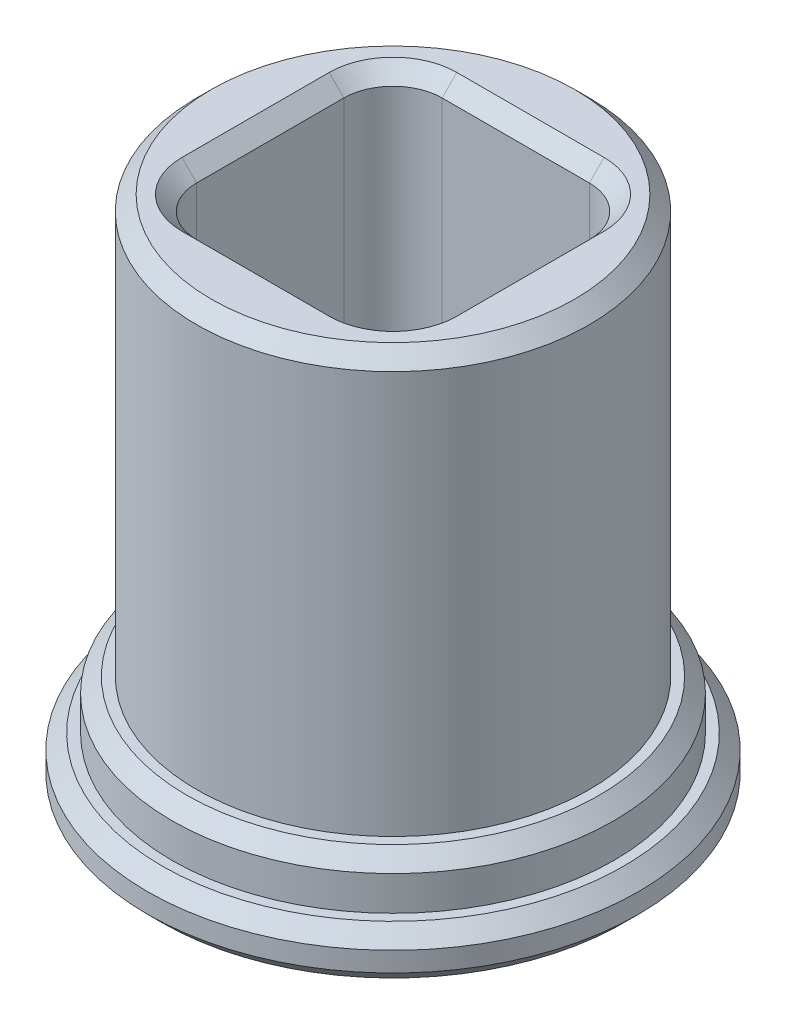
ISO-10303-21;
HEADER;
FILE_DESCRIPTION(('STEP AP214'),'2;1');
FILE_NAME('part.step','',(''),(''),'','','');
FILE_SCHEMA(('AUTOMOTIVE_DESIGN { 1 0 10303 214 1 1 1 1 }'));
ENDSEC;
DATA;
#1=APPLICATION_CONTEXT('core data for automotive mechanical design processes');
#2=APPLICATION_PROTOCOL_DEFINITION('international standard','automotive_design',2000,#1);
#3=PRODUCT_CONTEXT('',#1,'mechanical');
#4=PRODUCT('Part','Part','',(#3));
#5=PRODUCT_RELATED_PRODUCT_CATEGORY('part','',(#4));
#6=PRODUCT_DEFINITION_FORMATION('','',#4);
#7=PRODUCT_DEFINITION_CONTEXT('part definition',#1,'design');
#8=PRODUCT_DEFINITION('design','',#6,#7);
#9=PRODUCT_DEFINITION_SHAPE('','',#8);
#10=(LENGTH_UNIT() NAMED_UNIT(*) SI_UNIT(.MILLI.,.METRE.));
#11=(NAMED_UNIT(*) PLANE_ANGLE_UNIT() SI_UNIT($,.RADIAN.));
#12=(NAMED_UNIT(*) SI_UNIT($,.STERADIAN.) SOLID_ANGLE_UNIT());
#13=UNCERTAINTY_MEASURE_WITH_UNIT(LENGTH_MEASURE(1.E-05),#10,'distance_accuracy_value','');
#14=(GEOMETRIC_REPRESENTATION_CONTEXT(3) GLOBAL_UNCERTAINTY_ASSIGNED_CONTEXT((#13)) GLOBAL_UNIT_ASSIGNED_CONTEXT((#10,
#11,#12)) REPRESENTATION_CONTEXT('',''));
#15=CARTESIAN_POINT('',(0.,0.,0.));
#16=DIRECTION('',(0.,0.,1.));
#17=DIRECTION('',(1.,0.,0.));
#18=AXIS2_PLACEMENT_3D('',#15,#16,#17);
#19=CARTESIAN_POINT('',(0.,20.,0.));
#20=DIRECTION('',(0.,-1.,0.));
#21=DIRECTION('',(0.,0.,-1.));
#22=AXIS2_PLACEMENT_3D('',#19,#20,#21);
#23=CYLINDRICAL_SURFACE('',#22,2.2);
#24=CARTESIAN_POINT('',(0.,1.3,0.));
#25=DIRECTION('',(0.,-1.,0.));
#26=DIRECTION('',(0.,0.,-1.));
#27=AXIS2_PLACEMENT_3D('',#24,#25,#26);
#28=CIRCLE('',#27,2.2);
#29=CARTESIAN_POINT('',(0.,1.3,-2.2));
#30=VERTEX_POINT('',#29);
#31=EDGE_CURVE('E194',#30,#30,#28,.T.);
#32=ORIENTED_EDGE('',*,*,#31,.T.);
#33=EDGE_LOOP('',(#32));
#34=FACE_BOUND('',#33,.T.);
#35=CARTESIAN_POINT('',(0.,4.5,0.));
#36=DIRECTION('',(0.,-1.,0.));
#37=DIRECTION('',(0.,0.,-1.));
#38=AXIS2_PLACEMENT_3D('',#35,#36,#37);
#39=CIRCLE('',#38,2.2);
#40=CARTESIAN_POINT('',(0.,4.5,-2.2));
#41=VERTEX_POINT('',#40);
#42=EDGE_CURVE('E272',#41,#41,#39,.T.);
#43=ORIENTED_EDGE('',*,*,#42,.F.);
#44=EDGE_LOOP('',(#43));
#45=FACE_BOUND('',#44,.T.);
#46=ADVANCED_FACE('F43',(#34,#45),#23,.F.);
#47=CARTESIAN_POINT('',(0.,1.,0.));
#48=DIRECTION('',(0.,-1.,0.));
#49=DIRECTION('',(0.,0.,-1.));
#50=AXIS2_PLACEMENT_3D('',#47,#48,#49);
#51=CYLINDRICAL_SURFACE('',#50,5.);
#52=CARTESIAN_POINT('',(0.,0.300000000000002,0.));
#53=DIRECTION('',(0.,1.,0.));
#54=DIRECTION('',(0.,0.,1.));
#55=AXIS2_PLACEMENT_3D('',#52,#53,#54);
#56=CIRCLE('',#55,5.);
#57=CARTESIAN_POINT('',(0.,0.300000000000002,5.));
#58=VERTEX_POINT('',#57);
#59=EDGE_CURVE('E200',#58,#58,#56,.T.);
#60=ORIENTED_EDGE('',*,*,#59,.T.);
#61=EDGE_LOOP('',(#60));
#62=FACE_BOUND('',#61,.T.);
#63=CARTESIAN_POINT('',(0.,0.700000000000003,0.));
#64=DIRECTION('',(0.,1.,0.));
#65=DIRECTION('',(0.,0.,1.));
#66=AXIS2_PLACEMENT_3D('',#63,#64,#65);
#67=CIRCLE('',#66,5.);
#68=CARTESIAN_POINT('',(0.,0.700000000000003,5.));
#69=VERTEX_POINT('',#68);
#70=EDGE_CURVE('E197',#69,#69,#67,.F.);
#71=ORIENTED_EDGE('',*,*,#70,.T.);
#72=EDGE_LOOP('',(#71));
#73=FACE_BOUND('',#72,.T.);
#74=ADVANCED_FACE('F347',(#62,#73),#51,.T.);
#75=CARTESIAN_POINT('',(0.,1.,0.));
#76=DIRECTION('',(0.,1.,0.));
#77=DIRECTION('',(0.,0.,1.));
#78=AXIS2_PLACEMENT_3D('',#75,#76,#77);
#79=PLANE('',#78);
#80=CARTESIAN_POINT('',(0.,1.,0.));
#81=DIRECTION('',(0.,1.,0.));
#82=DIRECTION('',(0.,0.,1.));
#83=AXIS2_PLACEMENT_3D('',#80,#81,#82);
#84=CIRCLE('',#83,4.7);
#85=CARTESIAN_POINT('',(0.,1.,4.7));
#86=VERTEX_POINT('',#85);
#87=EDGE_CURVE('E203',#86,#86,#84,.T.);
#88=ORIENTED_EDGE('',*,*,#87,.T.);
#89=EDGE_LOOP('',(#88));
#90=FACE_BOUND('',#89,.T.);
#91=CARTESIAN_POINT('',(0.,1.,0.));
#92=DIRECTION('',(0.,1.,0.));
#93=DIRECTION('',(0.,0.,1.));
#94=AXIS2_PLACEMENT_3D('',#91,#92,#93);
#95=CIRCLE('',#94,4.5);
#96=CARTESIAN_POINT('',(0.,1.,4.5));
#97=VERTEX_POINT('',#96);
#98=EDGE_CURVE('E150',#97,#97,#95,.T.);
#99=ORIENTED_EDGE('',*,*,#98,.F.);
#100=EDGE_LOOP('',(#99));
#101=FACE_BOUND('',#100,.T.);
#102=ADVANCED_FACE('F353',(#90,#101),#79,.T.);
#103=CARTESIAN_POINT('',(0.,0.,0.));
#104=DIRECTION('',(0.,1.,0.));
#105=DIRECTION('',(0.,0.,1.));
#106=AXIS2_PLACEMENT_3D('',#103,#104,#105);
#107=PLANE('',#106);
#108=CARTESIAN_POINT('',(0.,0.,0.));
#109=DIRECTION('',(0.,1.,0.));
#110=DIRECTION('',(0.,0.,1.));
#111=AXIS2_PLACEMENT_3D('',#108,#109,#110);
#112=CIRCLE('',#111,4.05000000000001);
#113=CARTESIAN_POINT('',(0.,0.,-4.05000000000001));
#114=VERTEX_POINT('',#113);
#115=EDGE_CURVE('E188',#114,#114,#112,.T.);
#116=ORIENTED_EDGE('',*,*,#115,.T.);
#117=EDGE_LOOP('',(#116));
#118=FACE_BOUND('',#117,.T.);
#119=CARTESIAN_POINT('',(0.,0.,0.));
#120=DIRECTION('',(0.,1.,0.));
#121=DIRECTION('',(0.,0.,1.));
#122=AXIS2_PLACEMENT_3D('',#119,#120,#121);
#123=CIRCLE('',#122,4.7);
#124=CARTESIAN_POINT('',(0.,0.,4.7));
#125=VERTEX_POINT('',#124);
#126=EDGE_CURVE('E185',#125,#125,#123,.F.);
#127=ORIENTED_EDGE('',*,*,#126,.T.);
#128=EDGE_LOOP('',(#127));
#129=FACE_BOUND('',#128,.T.);
#130=ADVANCED_FACE('F385',(#118,#129),#107,.F.);
#131=CARTESIAN_POINT('',(0.,2.,0.));
#132=DIRECTION('',(0.,-1.,0.));
#133=DIRECTION('',(0.,0.,-1.));
#134=AXIS2_PLACEMENT_3D('',#131,#132,#133);
#135=CYLINDRICAL_SURFACE('',#134,4.5);
#136=CARTESIAN_POINT('',(0.,1.7,0.));
#137=DIRECTION('',(0.,1.,0.));
#138=DIRECTION('',(0.,0.,1.));
#139=AXIS2_PLACEMENT_3D('',#136,#137,#138);
#140=CIRCLE('',#139,4.5);
#141=CARTESIAN_POINT('',(0.,1.7,4.5));
#142=VERTEX_POINT('',#141);
#143=EDGE_CURVE('E209',#142,#142,#140,.F.);
#144=ORIENTED_EDGE('',*,*,#143,.T.);
#145=EDGE_LOOP('',(#144));
#146=FACE_BOUND('',#145,.T.);
#147=ORIENTED_EDGE('',*,*,#98,.T.);
#148=EDGE_LOOP('',(#147));
#149=FACE_BOUND('',#148,.T.);
#150=ADVANCED_FACE('F381',(#146,#149),#135,.T.);
#151=CARTESIAN_POINT('',(0.,2.,0.));
#152=DIRECTION('',(0.,1.,0.));
#153=DIRECTION('',(0.,0.,1.));
#154=AXIS2_PLACEMENT_3D('',#151,#152,#153);
#155=PLANE('',#154);
#156=CARTESIAN_POINT('',(0.,2.,0.));
#157=DIRECTION('',(0.,1.,0.));
#158=DIRECTION('',(0.,0.,1.));
#159=AXIS2_PLACEMENT_3D('',#156,#157,#158);
#160=CIRCLE('',#159,4.2);
#161=CARTESIAN_POINT('',(0.,2.,4.2));
#162=VERTEX_POINT('',#161);
#163=EDGE_CURVE('E206',#162,#162,#160,.T.);
#164=ORIENTED_EDGE('',*,*,#163,.T.);
#165=EDGE_LOOP('',(#164));
#166=FACE_BOUND('',#165,.T.);
#167=CARTESIAN_POINT('',(0.,2.,0.));
#168=DIRECTION('',(0.,1.,0.));
#169=DIRECTION('',(0.,0.,1.));
#170=AXIS2_PLACEMENT_3D('',#167,#168,#169);
#171=CIRCLE('',#170,4.);
#172=CARTESIAN_POINT('',(0.,2.,-4.));
#173=VERTEX_POINT('',#172);
#174=EDGE_CURVE('E285',#173,#173,#171,.T.);
#175=ORIENTED_EDGE('',*,*,#174,.F.);
#176=EDGE_LOOP('',(#175));
#177=FACE_BOUND('',#176,.T.);
#178=ADVANCED_FACE('F375',(#166,#177),#155,.T.);
#179=CARTESIAN_POINT('',(0.,10.5,0.));
#180=DIRECTION('',(0.,1.,0.));
#181=DIRECTION('',(0.,0.,1.));
#182=AXIS2_PLACEMENT_3D('',#179,#180,#181);
#183=PLANE('',#182);
#184=DIRECTION('',(1.,0.,0.));
#185=VECTOR('',#184,1.);
#186=CARTESIAN_POINT('',(1.5,10.5,-2.8));
#187=LINE('',#186,#185);
#188=CARTESIAN_POINT('',(-1.5,10.5,-2.8));
#189=VERTEX_POINT('',#188);
#190=CARTESIAN_POINT('',(1.5,10.5,-2.8));
#191=VERTEX_POINT('',#190);
#192=EDGE_CURVE('E219',#189,#191,#187,.T.);
#193=ORIENTED_EDGE('',*,*,#192,.T.);
#194=CARTESIAN_POINT('',(1.5,10.5,-1.5));
#195=DIRECTION('',(0.,1.,0.));
#196=DIRECTION('',(0.,0.,1.));
#197=AXIS2_PLACEMENT_3D('',#194,#195,#196);
#198=CIRCLE('',#197,1.3);
#199=CARTESIAN_POINT('',(2.8,10.5,-1.5));
#200=VERTEX_POINT('',#199);
#201=EDGE_CURVE('E229',#191,#200,#198,.F.);
#202=ORIENTED_EDGE('',*,*,#201,.T.);
#203=DIRECTION('',(0.,0.,1.));
#204=VECTOR('',#203,1.);
#205=CARTESIAN_POINT('',(2.8,10.5,0.));
#206=LINE('',#205,#204);
#207=CARTESIAN_POINT('',(2.8,10.5,1.5));
#208=VERTEX_POINT('',#207);
#209=EDGE_CURVE('E227',#200,#208,#206,.T.);
#210=ORIENTED_EDGE('',*,*,#209,.T.);
#211=CARTESIAN_POINT('',(1.5,10.5,1.5));
#212=DIRECTION('',(0.,1.,0.));
#213=DIRECTION('',(0.,0.,1.));
#214=AXIS2_PLACEMENT_3D('',#211,#212,#213);
#215=CIRCLE('',#214,1.3);
#216=CARTESIAN_POINT('',(1.5,10.5,2.8));
#217=VERTEX_POINT('',#216);
#218=EDGE_CURVE('E225',#208,#217,#215,.F.);
#219=ORIENTED_EDGE('',*,*,#218,.T.);
#220=DIRECTION('',(-1.,0.,0.));
#221=VECTOR('',#220,1.);
#222=CARTESIAN_POINT('',(0.,10.5,2.8));
#223=LINE('',#222,#221);
#224=CARTESIAN_POINT('',(-1.5,10.5,2.8));
#225=VERTEX_POINT('',#224);
#226=EDGE_CURVE('E223',#217,#225,#223,.T.);
#227=ORIENTED_EDGE('',*,*,#226,.T.);
#228=CARTESIAN_POINT('',(-1.5,10.5,1.5));
#229=DIRECTION('',(0.,1.,0.));
#230=DIRECTION('',(0.,0.,1.));
#231=AXIS2_PLACEMENT_3D('',#228,#229,#230);
#232=CIRCLE('',#231,1.3);
#233=CARTESIAN_POINT('',(-2.8,10.5,1.5));
#234=VERTEX_POINT('',#233);
#235=EDGE_CURVE('E221',#225,#234,#232,.F.);
#236=ORIENTED_EDGE('',*,*,#235,.T.);
#237=DIRECTION('',(0.,0.,-1.));
#238=VECTOR('',#237,1.);
#239=CARTESIAN_POINT('',(-2.8,10.5,-1.5));
#240=LINE('',#239,#238);
#241=CARTESIAN_POINT('',(-2.8,10.5,-1.5));
#242=VERTEX_POINT('',#241);
#243=EDGE_CURVE('E215',#234,#242,#240,.T.);
#244=ORIENTED_EDGE('',*,*,#243,.T.);
#245=CARTESIAN_POINT('',(-1.5,10.5,-1.5));
#246=DIRECTION('',(0.,1.,0.));
#247=DIRECTION('',(0.,0.,1.));
#248=AXIS2_PLACEMENT_3D('',#245,#246,#247);
#249=CIRCLE('',#248,1.3);
#250=EDGE_CURVE('E217',#242,#189,#249,.F.);
#251=ORIENTED_EDGE('',*,*,#250,.T.);
#252=EDGE_LOOP('',(#193,#202,#210,#219,#227,#236,#244,#251));
#253=FACE_BOUND('',#252,.T.);
#254=CARTESIAN_POINT('',(0.,10.5,0.));
#255=DIRECTION('',(0.,1.,0.));
#256=DIRECTION('',(0.,0.,1.));
#257=AXIS2_PLACEMENT_3D('',#254,#255,#256);
#258=CIRCLE('',#257,3.70000000000001);
#259=CARTESIAN_POINT('',(0.,10.5,3.70000000000001));
#260=VERTEX_POINT('',#259);
#261=EDGE_CURVE('E212',#260,#260,#258,.T.);
#262=ORIENTED_EDGE('',*,*,#261,.T.);
#263=EDGE_LOOP('',(#262));
#264=FACE_BOUND('',#263,.T.);
#265=ADVANCED_FACE('F329',(#253,#264),#183,.T.);
#266=CARTESIAN_POINT('',(0.,10.5,0.));
#267=DIRECTION('',(0.,-1.,0.));
#268=DIRECTION('',(0.,0.,-1.));
#269=AXIS2_PLACEMENT_3D('',#266,#267,#268);
#270=CYLINDRICAL_SURFACE('',#269,4.);
#271=CARTESIAN_POINT('',(0.,10.2,0.));
#272=DIRECTION('',(0.,1.,0.));
#273=DIRECTION('',(0.,0.,1.));
#274=AXIS2_PLACEMENT_3D('',#271,#272,#273);
#275=CIRCLE('',#274,4.);
#276=CARTESIAN_POINT('',(0.,10.2,-4.));
#277=VERTEX_POINT('',#276);
#278=EDGE_CURVE('E11',#277,#277,#275,.F.);
#279=CARTESIAN_POINT('',(0.,10.2,-4.));
#280=CARTESIAN_POINT('',(0.,10.1145833333333,-4.));
#281=CARTESIAN_POINT('',(0.,10.0291666666667,-4.));
#282=CARTESIAN_POINT('',(0.,9.85833333333334,-4.));
#283=CARTESIAN_POINT('',(0.,9.77291666666668,-4.));
#284=CARTESIAN_POINT('',(0.,9.60208333333334,-4.));
#285=CARTESIAN_POINT('',(0.,9.51666666666667,-4.));
#286=CARTESIAN_POINT('',(0.,9.34583333333334,-4.));
#287=CARTESIAN_POINT('',(0.,9.26041666666667,-4.));
#288=CARTESIAN_POINT('',(0.,9.08958333333334,-4.));
#289=CARTESIAN_POINT('',(0.,9.00416666666668,-4.));
#290=CARTESIAN_POINT('',(0.,8.83333333333334,-4.));
#291=CARTESIAN_POINT('',(0.,8.74791666666667,-4.));
#292=CARTESIAN_POINT('',(0.,8.57708333333334,-4.));
#293=CARTESIAN_POINT('',(0.,8.49166666666667,-4.));
#294=CARTESIAN_POINT('',(0.,8.32083333333334,-4.));
#295=CARTESIAN_POINT('',(0.,8.23541666666667,-4.));
#296=CARTESIAN_POINT('',(0.,8.06458333333334,-4.));
#297=CARTESIAN_POINT('',(0.,7.97916666666667,-4.));
#298=CARTESIAN_POINT('',(0.,7.80833333333334,-4.));
#299=CARTESIAN_POINT('',(0.,7.72291666666667,-4.));
#300=CARTESIAN_POINT('',(0.,7.55208333333334,-4.));
#301=CARTESIAN_POINT('',(0.,7.46666666666667,-4.));
#302=CARTESIAN_POINT('',(0.,7.29583333333334,-4.));
#303=CARTESIAN_POINT('',(0.,7.21041666666667,-4.));
#304=CARTESIAN_POINT('',(0.,7.03958333333334,-4.));
#305=CARTESIAN_POINT('',(0.,6.95416666666667,-4.));
#306=CARTESIAN_POINT('',(0.,6.78333333333334,-4.));
#307=CARTESIAN_POINT('',(0.,6.69791666666667,-4.));
#308=CARTESIAN_POINT('',(0.,6.52708333333334,-4.));
#309=CARTESIAN_POINT('',(0.,6.44166666666667,-4.));
#310=CARTESIAN_POINT('',(0.,6.27083333333334,-4.));
#311=CARTESIAN_POINT('',(0.,6.18541666666667,-4.));
#312=CARTESIAN_POINT('',(0.,6.01458333333334,-4.));
#313=CARTESIAN_POINT('',(0.,5.92916666666667,-4.));
#314=CARTESIAN_POINT('',(0.,5.75833333333334,-4.));
#315=CARTESIAN_POINT('',(0.,5.67291666666667,-4.));
#316=CARTESIAN_POINT('',(0.,5.50208333333334,-4.));
#317=CARTESIAN_POINT('',(0.,5.41666666666667,-4.));
#318=CARTESIAN_POINT('',(0.,5.24583333333334,-4.));
#319=CARTESIAN_POINT('',(0.,5.16041666666667,-4.));
#320=CARTESIAN_POINT('',(0.,4.98958333333334,-4.));
#321=CARTESIAN_POINT('',(0.,4.90416666666667,-4.));
#322=CARTESIAN_POINT('',(0.,4.73333333333334,-4.));
#323=CARTESIAN_POINT('',(0.,4.64791666666667,-4.));
#324=CARTESIAN_POINT('',(0.,4.47708333333334,-4.));
#325=CARTESIAN_POINT('',(0.,4.39166666666667,-4.));
#326=CARTESIAN_POINT('',(0.,4.22083333333333,-4.));
#327=CARTESIAN_POINT('',(0.,4.13541666666667,-4.));
#328=CARTESIAN_POINT('',(0.,3.96458333333333,-4.));
#329=CARTESIAN_POINT('',(0.,3.87916666666667,-4.));
#330=CARTESIAN_POINT('',(0.,3.70833333333333,-4.));
#331=CARTESIAN_POINT('',(0.,3.62291666666667,-4.));
#332=CARTESIAN_POINT('',(0.,3.45208333333333,-4.));
#333=CARTESIAN_POINT('',(0.,3.36666666666667,-4.));
#334=CARTESIAN_POINT('',(0.,3.19583333333333,-4.));
#335=CARTESIAN_POINT('',(0.,3.11041666666667,-4.));
#336=CARTESIAN_POINT('',(0.,2.93958333333333,-4.));
#337=CARTESIAN_POINT('',(0.,2.85416666666667,-4.));
#338=CARTESIAN_POINT('',(0.,2.68333333333333,-4.));
#339=CARTESIAN_POINT('',(0.,2.59791666666667,-4.));
#340=CARTESIAN_POINT('',(0.,2.42708333333333,-4.));
#341=CARTESIAN_POINT('',(0.,2.34166666666667,-4.));
#342=CARTESIAN_POINT('',(0.,2.17083333333333,-4.));
#343=CARTESIAN_POINT('',(0.,2.08541666666666,-4.));
#344=CARTESIAN_POINT('',(0.,2.,-4.));
#345=B_SPLINE_CURVE_WITH_KNOTS('',3,(#279,#280,#281,#282,#283,#284,#285,#286,#287,#288,#289,
#290,#291,#292,#293,#294,#295,#296,#297,#298,#299,#300,#301,#302,#303,#304,#305,#306,#307,#308,
#309,#310,#311,#312,#313,#314,#315,#316,#317,#318,#319,#320,#321,#322,#323,#324,#325,#326,#327,
#328,#329,#330,#331,#332,#333,#334,#335,#336,#337,#338,#339,#340,#341,#342,#343,#344),
.UNSPECIFIED.,.F.,.F.,(4,2,2,2,2,2,2,2,2,2,2,2,2,2,2,2,2,2,2,2,2,2,2,2,2,2,2,2,2,2,2,2,4),(0.,
0.25625,0.512500000000001,0.76875,1.025,1.28125,1.5375,1.79375,2.05,2.30625,2.5625,2.81875,
3.075,3.33125,3.5875,3.84375,4.1,4.35625000000001,4.61250000000001,4.86875000000001,
5.12500000000001,5.38125000000001,5.63750000000001,5.89375000000001,6.15000000000001,
6.40625000000001,6.66250000000001,6.91875000000001,7.17500000000001,7.43125000000001,
7.68750000000001,7.94375000000001,8.20000000000001),.UNSPECIFIED.);
#346=EDGE_CURVE('BSEAM372',#277,#173,#345,.T.);
#347=ORIENTED_EDGE('',*,*,#278,.T.);
#348=ORIENTED_EDGE('',*,*,#174,.T.);
#349=ORIENTED_EDGE('',*,*,#346,.T.);
#350=ORIENTED_EDGE('',*,*,#346,.F.);
#351=EDGE_LOOP('',(#347,#349,#348,#350));
#352=FACE_BOUND('',#351,.T.);
#353=ADVANCED_FACE('F372',(#352),#270,.T.);
#354=CARTESIAN_POINT('',(-2.5,4.5,0.));
#355=DIRECTION('',(-1.,0.,0.));
#356=DIRECTION('',(0.,0.,1.));
#357=AXIS2_PLACEMENT_3D('',#354,#355,#356);
#358=PLANE('',#357);
#359=DIRECTION('',(0.,1.,0.));
#360=VECTOR('',#359,1.);
#361=CARTESIAN_POINT('',(-2.5,10.5,-1.5));
#362=LINE('',#361,#360);
#363=CARTESIAN_POINT('',(-2.5,4.5,-1.5));
#364=VERTEX_POINT('',#363);
#365=CARTESIAN_POINT('',(-2.5,10.2,-1.5));
#366=VERTEX_POINT('',#365);
#367=EDGE_CURVE('E175',#364,#366,#362,.T.);
#368=ORIENTED_EDGE('',*,*,#367,.T.);
#369=DIRECTION('',(0.,0.,1.));
#370=VECTOR('',#369,1.);
#371=CARTESIAN_POINT('',(-2.5,10.2,1.5));
#372=LINE('',#371,#370);
#373=CARTESIAN_POINT('',(-2.5,10.2,1.5));
#374=VERTEX_POINT('',#373);
#375=EDGE_CURVE('E53',#366,#374,#372,.T.);
#376=ORIENTED_EDGE('',*,*,#375,.T.);
#377=DIRECTION('',(0.,1.,0.));
#378=VECTOR('',#377,1.);
#379=CARTESIAN_POINT('',(-2.5,4.5,1.5));
#380=LINE('',#379,#378);
#381=CARTESIAN_POINT('',(-2.5,4.5,1.5));
#382=VERTEX_POINT('',#381);
#383=EDGE_CURVE('E177',#374,#382,#380,.F.);
#384=ORIENTED_EDGE('',*,*,#383,.T.);
#385=DIRECTION('',(0.,0.,1.));
#386=VECTOR('',#385,1.);
#387=CARTESIAN_POINT('',(-2.5,4.5,0.));
#388=LINE('',#387,#386);
#389=EDGE_CURVE('E277',#364,#382,#388,.T.);
#390=ORIENTED_EDGE('',*,*,#389,.F.);
#391=EDGE_LOOP('',(#368,#376,#384,#390));
#392=FACE_BOUND('',#391,.T.);
#393=ADVANCED_FACE('F319',(#392),#358,.F.);
#394=CARTESIAN_POINT('',(0.,4.5,-2.5));
#395=DIRECTION('',(0.,0.,-1.));
#396=DIRECTION('',(-1.,0.,0.));
#397=AXIS2_PLACEMENT_3D('',#394,#395,#396);
#398=PLANE('',#397);
#399=DIRECTION('',(0.,1.,0.));
#400=VECTOR('',#399,1.);
#401=CARTESIAN_POINT('',(1.5,4.5,-2.5));
#402=LINE('',#401,#400);
#403=CARTESIAN_POINT('',(1.5,4.5,-2.5));
#404=VERTEX_POINT('',#403);
#405=CARTESIAN_POINT('',(1.5,10.2,-2.5));
#406=VERTEX_POINT('',#405);
#407=EDGE_CURVE('E165',#404,#406,#402,.T.);
#408=ORIENTED_EDGE('',*,*,#407,.T.);
#409=DIRECTION('',(-1.,0.,0.));
#410=VECTOR('',#409,1.);
#411=CARTESIAN_POINT('',(-1.5,10.2,-2.5));
#412=LINE('',#411,#410);
#413=CARTESIAN_POINT('',(-1.5,10.2,-2.5));
#414=VERTEX_POINT('',#413);
#415=EDGE_CURVE('E69',#406,#414,#412,.T.);
#416=ORIENTED_EDGE('',*,*,#415,.T.);
#417=DIRECTION('',(0.,1.,0.));
#418=VECTOR('',#417,1.);
#419=CARTESIAN_POINT('',(-1.5,4.5,-2.5));
#420=LINE('',#419,#418);
#421=CARTESIAN_POINT('',(-1.5,4.5,-2.5));
#422=VERTEX_POINT('',#421);
#423=EDGE_CURVE('E179',#414,#422,#420,.F.);
#424=ORIENTED_EDGE('',*,*,#423,.T.);
#425=DIRECTION('',(-1.,0.,0.));
#426=VECTOR('',#425,1.);
#427=CARTESIAN_POINT('',(0.,4.5,-2.5));
#428=LINE('',#427,#426);
#429=EDGE_CURVE('E160',#404,#422,#428,.T.);
#430=ORIENTED_EDGE('',*,*,#429,.F.);
#431=EDGE_LOOP('',(#408,#416,#424,#430));
#432=FACE_BOUND('',#431,.T.);
#433=ADVANCED_FACE('F314',(#432),#398,.F.);
#434=CARTESIAN_POINT('',(2.5,4.5,0.));
#435=DIRECTION('',(-1.,0.,0.));
#436=DIRECTION('',(0.,0.,1.));
#437=AXIS2_PLACEMENT_3D('',#434,#435,#436);
#438=PLANE('',#437);
#439=DIRECTION('',(0.,1.,0.));
#440=VECTOR('',#439,1.);
#441=CARTESIAN_POINT('',(2.5,10.5,1.5));
#442=LINE('',#441,#440);
#443=CARTESIAN_POINT('',(2.5,4.5,1.5));
#444=VERTEX_POINT('',#443);
#445=CARTESIAN_POINT('',(2.5,10.2,1.5));
#446=VERTEX_POINT('',#445);
#447=EDGE_CURVE('E149',#444,#446,#442,.T.);
#448=ORIENTED_EDGE('',*,*,#447,.T.);
#449=DIRECTION('',(0.,0.,-1.));
#450=VECTOR('',#449,1.);
#451=CARTESIAN_POINT('',(2.5,10.2,0.));
#452=LINE('',#451,#450);
#453=CARTESIAN_POINT('',(2.5,10.2,-1.5));
#454=VERTEX_POINT('',#453);
#455=EDGE_CURVE('E144',#446,#454,#452,.T.);
#456=ORIENTED_EDGE('',*,*,#455,.T.);
#457=DIRECTION('',(0.,1.,0.));
#458=VECTOR('',#457,1.);
#459=CARTESIAN_POINT('',(2.5,4.5,-1.5));
#460=LINE('',#459,#458);
#461=CARTESIAN_POINT('',(2.5,4.5,-1.5));
#462=VERTEX_POINT('',#461);
#463=EDGE_CURVE('E137',#454,#462,#460,.F.);
#464=ORIENTED_EDGE('',*,*,#463,.T.);
#465=DIRECTION('',(0.,0.,1.));
#466=VECTOR('',#465,1.);
#467=CARTESIAN_POINT('',(2.5,4.5,0.));
#468=LINE('',#467,#466);
#469=EDGE_CURVE('E141',#462,#444,#468,.T.);
#470=ORIENTED_EDGE('',*,*,#469,.T.);
#471=EDGE_LOOP('',(#448,#456,#464,#470));
#472=FACE_BOUND('',#471,.T.);
#473=ADVANCED_FACE('F140',(#472),#438,.T.);
#474=CARTESIAN_POINT('',(0.,4.5,2.5));
#475=DIRECTION('',(0.,0.,-1.));
#476=DIRECTION('',(-1.,0.,0.));
#477=AXIS2_PLACEMENT_3D('',#474,#475,#476);
#478=PLANE('',#477);
#479=DIRECTION('',(0.,1.,0.));
#480=VECTOR('',#479,1.);
#481=CARTESIAN_POINT('',(-1.5,4.5,2.5));
#482=LINE('',#481,#480);
#483=CARTESIAN_POINT('',(-1.5,4.5,2.5));
#484=VERTEX_POINT('',#483);
#485=CARTESIAN_POINT('',(-1.5,10.2,2.5));
#486=VERTEX_POINT('',#485);
#487=EDGE_CURVE('E291',#484,#486,#482,.T.);
#488=ORIENTED_EDGE('',*,*,#487,.T.);
#489=DIRECTION('',(1.,0.,0.));
#490=VECTOR('',#489,1.);
#491=CARTESIAN_POINT('',(0.,10.2,2.5));
#492=LINE('',#491,#490);
#493=CARTESIAN_POINT('',(1.5,10.2,2.5));
#494=VERTEX_POINT('',#493);
#495=EDGE_CURVE('E237',#486,#494,#492,.T.);
#496=ORIENTED_EDGE('',*,*,#495,.T.);
#497=DIRECTION('',(0.,1.,0.));
#498=VECTOR('',#497,1.);
#499=CARTESIAN_POINT('',(1.5,4.5,2.5));
#500=LINE('',#499,#498);
#501=CARTESIAN_POINT('',(1.5,4.5,2.5));
#502=VERTEX_POINT('',#501);
#503=EDGE_CURVE('E170',#494,#502,#500,.F.);
#504=ORIENTED_EDGE('',*,*,#503,.T.);
#505=DIRECTION('',(-1.,0.,0.));
#506=VECTOR('',#505,1.);
#507=CARTESIAN_POINT('',(0.,4.5,2.5));
#508=LINE('',#507,#506);
#509=EDGE_CURVE('E161',#502,#484,#508,.T.);
#510=ORIENTED_EDGE('',*,*,#509,.T.);
#511=EDGE_LOOP('',(#488,#496,#504,#510));
#512=FACE_BOUND('',#511,.T.);
#513=ADVANCED_FACE('F295',(#512),#478,.T.);
#514=CARTESIAN_POINT('',(0.,4.5,0.));
#515=DIRECTION('',(0.,-1.,0.));
#516=DIRECTION('',(0.,0.,-1.));
#517=AXIS2_PLACEMENT_3D('',#514,#515,#516);
#518=PLANE('',#517);
#519=ORIENTED_EDGE('',*,*,#42,.T.);
#520=EDGE_LOOP('',(#519));
#521=FACE_BOUND('',#520,.T.);
#522=ORIENTED_EDGE('',*,*,#509,.F.);
#523=CARTESIAN_POINT('',(1.5,4.5,1.5));
#524=DIRECTION('',(0.,-1.,0.));
#525=DIRECTION('',(0.,0.,-1.));
#526=AXIS2_PLACEMENT_3D('',#523,#524,#525);
#527=CIRCLE('',#526,1.);
#528=EDGE_CURVE('E159',#502,#444,#527,.F.);
#529=ORIENTED_EDGE('',*,*,#528,.T.);
#530=ORIENTED_EDGE('',*,*,#469,.F.);
#531=CARTESIAN_POINT('',(1.5,4.5,-1.5));
#532=DIRECTION('',(0.,-1.,0.));
#533=DIRECTION('',(0.,0.,-1.));
#534=AXIS2_PLACEMENT_3D('',#531,#532,#533);
#535=CIRCLE('',#534,1.);
#536=EDGE_CURVE('E156',#462,#404,#535,.F.);
#537=ORIENTED_EDGE('',*,*,#536,.T.);
#538=ORIENTED_EDGE('',*,*,#429,.T.);
#539=CARTESIAN_POINT('',(-1.5,4.5,-1.5));
#540=DIRECTION('',(0.,-1.,0.));
#541=DIRECTION('',(0.,0.,-1.));
#542=AXIS2_PLACEMENT_3D('',#539,#540,#541);
#543=CIRCLE('',#542,1.);
#544=EDGE_CURVE('E167',#422,#364,#543,.F.);
#545=ORIENTED_EDGE('',*,*,#544,.T.);
#546=ORIENTED_EDGE('',*,*,#389,.T.);
#547=CARTESIAN_POINT('',(-1.5,4.5,1.5));
#548=DIRECTION('',(0.,-1.,0.));
#549=DIRECTION('',(0.,0.,-1.));
#550=AXIS2_PLACEMENT_3D('',#547,#548,#549);
#551=CIRCLE('',#550,1.);
#552=EDGE_CURVE('E166',#382,#484,#551,.F.);
#553=ORIENTED_EDGE('',*,*,#552,.T.);
#554=EDGE_LOOP('',(#522,#529,#530,#537,#538,#545,#546,#553));
#555=FACE_BOUND('',#554,.T.);
#556=ADVANCED_FACE('F154',(#521,#555),#518,.F.);
#557=CARTESIAN_POINT('',(0.,1.,0.));
#558=DIRECTION('',(0.,-1.,0.));
#559=DIRECTION('',(0.,0.,-1.));
#560=AXIS2_PLACEMENT_3D('',#557,#558,#559);
#561=PLANE('',#560);
#562=CARTESIAN_POINT('',(0.,1.,0.));
#563=DIRECTION('',(0.,-1.,0.));
#564=DIRECTION('',(0.,0.,-1.));
#565=AXIS2_PLACEMENT_3D('',#562,#563,#564);
#566=CIRCLE('',#565,2.5);
#567=CARTESIAN_POINT('',(0.,1.,-2.5));
#568=VERTEX_POINT('',#567);
#569=EDGE_CURVE('E191',#568,#568,#566,.F.);
#570=ORIENTED_EDGE('',*,*,#569,.T.);
#571=EDGE_LOOP('',(#570));
#572=FACE_BOUND('',#571,.T.);
#573=CARTESIAN_POINT('',(0.,1.,0.));
#574=DIRECTION('',(0.,-1.,0.));
#575=DIRECTION('',(0.,0.,-1.));
#576=AXIS2_PLACEMENT_3D('',#573,#574,#575);
#577=CIRCLE('',#576,3.75);
#578=CARTESIAN_POINT('',(0.,1.,-3.75));
#579=VERTEX_POINT('',#578);
#580=EDGE_CURVE('E266',#579,#579,#577,.T.);
#581=ORIENTED_EDGE('',*,*,#580,.T.);
#582=EDGE_LOOP('',(#581));
#583=FACE_BOUND('',#582,.T.);
#584=ADVANCED_FACE('F362',(#572,#583),#561,.T.);
#585=CARTESIAN_POINT('',(0.,1.,0.));
#586=DIRECTION('',(0.,-1.,0.));
#587=DIRECTION('',(0.,0.,-1.));
#588=AXIS2_PLACEMENT_3D('',#585,#586,#587);
#589=CYLINDRICAL_SURFACE('',#588,3.75);
#590=CARTESIAN_POINT('',(0.,0.300000000000003,0.));
#591=DIRECTION('',(0.,1.,0.));
#592=DIRECTION('',(0.,0.,1.));
#593=AXIS2_PLACEMENT_3D('',#590,#591,#592);
#594=CIRCLE('',#593,3.75);
#595=CARTESIAN_POINT('',(0.,0.300000000000003,-3.75));
#596=VERTEX_POINT('',#595);
#597=EDGE_CURVE('E182',#596,#596,#594,.F.);
#598=ORIENTED_EDGE('',*,*,#597,.T.);
#599=EDGE_LOOP('',(#598));
#600=FACE_BOUND('',#599,.T.);
#601=ORIENTED_EDGE('',*,*,#580,.F.);
#602=EDGE_LOOP('',(#601));
#603=FACE_BOUND('',#602,.T.);
#604=ADVANCED_FACE('F344',(#600,#603),#589,.F.);
#605=CARTESIAN_POINT('',(1.5,4.5,1.5));
#606=DIRECTION('',(0.,-1.,0.));
#607=DIRECTION('',(0.,0.,-1.));
#608=AXIS2_PLACEMENT_3D('',#605,#606,#607);
#609=CYLINDRICAL_SURFACE('',#608,1.);
#610=ORIENTED_EDGE('',*,*,#503,.F.);
#611=CARTESIAN_POINT('',(1.5,10.2,1.5));
#612=DIRECTION('',(0.,1.,0.));
#613=DIRECTION('',(0.,0.,1.));
#614=AXIS2_PLACEMENT_3D('',#611,#612,#613);
#615=CIRCLE('',#614,1.);
#616=EDGE_CURVE('E235',#494,#446,#615,.T.);
#617=ORIENTED_EDGE('',*,*,#616,.T.);
#618=ORIENTED_EDGE('',*,*,#447,.F.);
#619=ORIENTED_EDGE('',*,*,#528,.F.);
#620=EDGE_LOOP('',(#610,#617,#618,#619));
#621=FACE_BOUND('',#620,.T.);
#622=ADVANCED_FACE('F300',(#621),#609,.F.);
#623=CARTESIAN_POINT('',(-1.5,4.5,1.5));
#624=DIRECTION('',(0.,1.,0.));
#625=DIRECTION('',(0.,0.,1.));
#626=AXIS2_PLACEMENT_3D('',#623,#624,#625);
#627=CYLINDRICAL_SURFACE('',#626,1.);
#628=ORIENTED_EDGE('',*,*,#383,.F.);
#629=CARTESIAN_POINT('',(-1.5,10.2,1.5));
#630=DIRECTION('',(0.,1.,0.));
#631=DIRECTION('',(0.,0.,1.));
#632=AXIS2_PLACEMENT_3D('',#629,#630,#631);
#633=CIRCLE('',#632,1.);
#634=EDGE_CURVE('E239',#374,#486,#633,.T.);
#635=ORIENTED_EDGE('',*,*,#634,.T.);
#636=ORIENTED_EDGE('',*,*,#487,.F.);
#637=ORIENTED_EDGE('',*,*,#552,.F.);
#638=EDGE_LOOP('',(#628,#635,#636,#637));
#639=FACE_BOUND('',#638,.T.);
#640=ADVANCED_FACE('F336',(#639),#627,.F.);
#641=CARTESIAN_POINT('',(1.5,4.5,-1.5));
#642=DIRECTION('',(0.,1.,0.));
#643=DIRECTION('',(0.,0.,1.));
#644=AXIS2_PLACEMENT_3D('',#641,#642,#643);
#645=CYLINDRICAL_SURFACE('',#644,1.);
#646=ORIENTED_EDGE('',*,*,#463,.F.);
#647=CARTESIAN_POINT('',(1.5,10.2,-1.5));
#648=DIRECTION('',(0.,1.,0.));
#649=DIRECTION('',(0.,0.,1.));
#650=AXIS2_PLACEMENT_3D('',#647,#648,#649);
#651=CIRCLE('',#650,1.);
#652=EDGE_CURVE('E232',#454,#406,#651,.T.);
#653=ORIENTED_EDGE('',*,*,#652,.T.);
#654=ORIENTED_EDGE('',*,*,#407,.F.);
#655=ORIENTED_EDGE('',*,*,#536,.F.);
#656=EDGE_LOOP('',(#646,#653,#654,#655));
#657=FACE_BOUND('',#656,.T.);
#658=ADVANCED_FACE('F164',(#657),#645,.F.);
#659=CARTESIAN_POINT('',(-1.5,4.5,-1.5));
#660=DIRECTION('',(0.,-1.,0.));
#661=DIRECTION('',(0.,0.,-1.));
#662=AXIS2_PLACEMENT_3D('',#659,#660,#661);
#663=CYLINDRICAL_SURFACE('',#662,1.);
#664=ORIENTED_EDGE('',*,*,#423,.F.);
#665=CARTESIAN_POINT('',(-1.5,10.2,-1.5));
#666=DIRECTION('',(0.,1.,0.));
#667=DIRECTION('',(0.,0.,1.));
#668=AXIS2_PLACEMENT_3D('',#665,#666,#667);
#669=CIRCLE('',#668,1.);
#670=EDGE_CURVE('E61',#414,#366,#669,.T.);
#671=ORIENTED_EDGE('',*,*,#670,.T.);
#672=ORIENTED_EDGE('',*,*,#367,.F.);
#673=ORIENTED_EDGE('',*,*,#544,.F.);
#674=EDGE_LOOP('',(#664,#671,#672,#673));
#675=FACE_BOUND('',#674,.T.);
#676=ADVANCED_FACE('F317',(#675),#663,.F.);
#677=CARTESIAN_POINT('',(0.,0.300000000000003,0.));
#678=DIRECTION('',(0.,-1.,0.));
#679=DIRECTION('',(0.,0.,-1.));
#680=AXIS2_PLACEMENT_3D('',#677,#678,#679);
#681=CONICAL_SURFACE('',#680,3.75,0.785398163397452);
#682=CARTESIAN_POINT('',(0.,0.,-4.05000000000001));
#683=CARTESIAN_POINT('',(0.,0.00312500000000018,-4.04687500000001));
#684=CARTESIAN_POINT('',(0.,0.00625000000000015,-4.04375));
#685=CARTESIAN_POINT('',(0.,0.0125000000000001,-4.0375));
#686=CARTESIAN_POINT('',(0.,0.0156250000000001,-4.03437500000001));
#687=CARTESIAN_POINT('',(0.,0.0218750000000001,-4.028125));
#688=CARTESIAN_POINT('',(0.,0.0250000000000001,-4.025));
#689=CARTESIAN_POINT('',(0.,0.0312500000000003,-4.01875000000001));
#690=CARTESIAN_POINT('',(0.,0.0343750000000004,-4.015625));
#691=CARTESIAN_POINT('',(0.,0.0406250000000004,-4.009375));
#692=CARTESIAN_POINT('',(0.,0.0437500000000003,-4.00625));
#693=CARTESIAN_POINT('',(0.,0.0500000000000004,-4.));
#694=CARTESIAN_POINT('',(0.,0.0531250000000005,-3.996875));
#695=CARTESIAN_POINT('',(0.,0.0593750000000006,-3.990625));
#696=CARTESIAN_POINT('',(0.,0.0625000000000005,-3.9875));
#697=CARTESIAN_POINT('',(0.,0.0687500000000005,-3.98125));
#698=CARTESIAN_POINT('',(0.,0.0718750000000006,-3.978125));
#699=CARTESIAN_POINT('',(0.,0.0781250000000007,-3.971875));
#700=CARTESIAN_POINT('',(0.,0.0812500000000008,-3.96875));
#701=CARTESIAN_POINT('',(0.,0.0875000000000009,-3.9625));
#702=CARTESIAN_POINT('',(0.,0.0906250000000008,-3.959375));
#703=CARTESIAN_POINT('',(0.,0.0968750000000008,-3.953125));
#704=CARTESIAN_POINT('',(0.,0.100000000000001,-3.95));
#705=CARTESIAN_POINT('',(0.,0.106250000000001,-3.94375));
#706=CARTESIAN_POINT('',(0.,0.109375000000001,-3.940625));
#707=CARTESIAN_POINT('',(0.,0.115625000000001,-3.934375));
#708=CARTESIAN_POINT('',(0.,0.118750000000001,-3.93125));
#709=CARTESIAN_POINT('',(0.,0.125000000000001,-3.925));
#710=CARTESIAN_POINT('',(0.,0.128125000000001,-3.921875));
#711=CARTESIAN_POINT('',(0.,0.134375000000001,-3.915625));
#712=CARTESIAN_POINT('',(0.,0.137500000000001,-3.9125));
#713=CARTESIAN_POINT('',(0.,0.143750000000001,-3.90625));
#714=CARTESIAN_POINT('',(0.,0.146875000000001,-3.903125));
#715=CARTESIAN_POINT('',(0.,0.153125000000001,-3.896875));
#716=CARTESIAN_POINT('',(0.,0.156250000000001,-3.89375));
#717=CARTESIAN_POINT('',(0.,0.162500000000002,-3.8875));
#718=CARTESIAN_POINT('',(0.,0.165625000000002,-3.884375));
#719=CARTESIAN_POINT('',(0.,0.171875000000002,-3.878125));
#720=CARTESIAN_POINT('',(0.,0.175000000000002,-3.875));
#721=CARTESIAN_POINT('',(0.,0.181250000000002,-3.86875));
#722=CARTESIAN_POINT('',(0.,0.184375000000002,-3.865625));
#723=CARTESIAN_POINT('',(0.,0.190625000000002,-3.859375));
#724=CARTESIAN_POINT('',(0.,0.193750000000002,-3.85625));
#725=CARTESIAN_POINT('',(0.,0.200000000000002,-3.85));
#726=CARTESIAN_POINT('',(0.,0.203125000000002,-3.846875));
#727=CARTESIAN_POINT('',(0.,0.209375000000002,-3.840625));
#728=CARTESIAN_POINT('',(0.,0.212500000000002,-3.8375));
#729=CARTESIAN_POINT('',(0.,0.218750000000002,-3.83125));
#730=CARTESIAN_POINT('',(0.,0.221875000000002,-3.828125));
#731=CARTESIAN_POINT('',(0.,0.228125000000002,-3.821875));
#732=CARTESIAN_POINT('',(0.,0.231250000000002,-3.81875));
#733=CARTESIAN_POINT('',(0.,0.237500000000002,-3.8125));
#734=CARTESIAN_POINT('',(0.,0.240625000000002,-3.809375));
#735=CARTESIAN_POINT('',(0.,0.246875000000002,-3.803125));
#736=CARTESIAN_POINT('',(0.,0.250000000000002,-3.8));
#737=CARTESIAN_POINT('',(0.,0.256250000000002,-3.79375));
#738=CARTESIAN_POINT('',(0.,0.259375000000003,-3.790625));
#739=CARTESIAN_POINT('',(0.,0.265625000000003,-3.784375));
#740=CARTESIAN_POINT('',(0.,0.268750000000003,-3.78125));
#741=CARTESIAN_POINT('',(0.,0.275000000000003,-3.775));
#742=CARTESIAN_POINT('',(0.,0.278125000000003,-3.771875));
#743=CARTESIAN_POINT('',(0.,0.284375000000003,-3.765625));
#744=CARTESIAN_POINT('',(0.,0.287500000000003,-3.7625));
#745=CARTESIAN_POINT('',(0.,0.293750000000003,-3.75625));
#746=CARTESIAN_POINT('',(0.,0.296875000000003,-3.753125));
#747=CARTESIAN_POINT('',(0.,0.300000000000003,-3.75));
#748=B_SPLINE_CURVE_WITH_KNOTS('',3,(#682,#683,#684,#685,#686,#687,#688,#689,#690,#691,#692,
#693,#694,#695,#696,#697,#698,#699,#700,#701,#702,#703,#704,#705,#706,#707,#708,#709,#710,#711,
#712,#713,#714,#715,#716,#717,#718,#719,#720,#721,#722,#723,#724,#725,#726,#727,#728,#729,#730,
#731,#732,#733,#734,#735,#736,#737,#738,#739,#740,#741,#742,#743,#744,#745,#746,#747),
.UNSPECIFIED.,.F.,.F.,(4,2,2,2,2,2,2,2,2,2,2,2,2,2,2,2,2,2,2,2,2,2,2,2,2,2,2,2,2,2,2,2,4),(0.,
0.0132582521472477,0.0265165042944961,0.0397747564417437,0.0530330085889915,0.0662912607362398,
0.0795495128834875,0.0928077650307358,0.106066017177984,0.119324269325231,0.13258252147248,
0.145840773619727,0.159099025766975,0.172357277914223,0.185615530061471,0.198873782208719,
0.212132034355967,0.225390286503215,0.238648538650463,0.251906790797711,0.265165042944959,
0.278423295092207,0.291681547239455,0.304939799386703,0.318198051533951,0.331456303681199,
0.344714555828447,0.357972807975695,0.371231060122943,0.384489312270191,0.397747564417438,
0.411005816564686,0.424264068711934),.UNSPECIFIED.);
#749=EDGE_CURVE('BSEAM573',#114,#596,#748,.T.);
#750=ORIENTED_EDGE('',*,*,#115,.F.);
#751=ORIENTED_EDGE('',*,*,#597,.F.);
#752=ORIENTED_EDGE('',*,*,#749,.T.);
#753=ORIENTED_EDGE('',*,*,#749,.F.);
#754=EDGE_LOOP('',(#750,#752,#751,#753));
#755=FACE_BOUND('',#754,.T.);
#756=ADVANCED_FACE('F573',(#755),#681,.F.);
#757=CARTESIAN_POINT('',(0.,1.,0.));
#758=DIRECTION('',(0.,-1.,0.));
#759=DIRECTION('',(0.,0.,-1.));
#760=AXIS2_PLACEMENT_3D('',#757,#758,#759);
#761=CONICAL_SURFACE('',#760,2.5,0.785398163397449);
#762=ORIENTED_EDGE('',*,*,#31,.F.);
#763=EDGE_LOOP('',(#762));
#764=FACE_BOUND('',#763,.T.);
#765=ORIENTED_EDGE('',*,*,#569,.F.);
#766=EDGE_LOOP('',(#765));
#767=FACE_BOUND('',#766,.T.);
#768=ADVANCED_FACE('F402',(#764,#767),#761,.F.);
#769=CARTESIAN_POINT('',(0.,0.300000000000002,0.));
#770=DIRECTION('',(0.,1.,0.));
#771=DIRECTION('',(0.,0.,1.));
#772=AXIS2_PLACEMENT_3D('',#769,#770,#771);
#773=CONICAL_SURFACE('',#772,5.,0.78539816339745);
#774=ORIENTED_EDGE('',*,*,#126,.F.);
#775=EDGE_LOOP('',(#774));
#776=FACE_BOUND('',#775,.T.);
#777=ORIENTED_EDGE('',*,*,#59,.F.);
#778=EDGE_LOOP('',(#777));
#779=FACE_BOUND('',#778,.T.);
#780=ADVANCED_FACE('F398',(#776,#779),#773,.T.);
#781=CARTESIAN_POINT('',(0.,1.,0.));
#782=DIRECTION('',(0.,-1.,0.));
#783=DIRECTION('',(0.,0.,-1.));
#784=AXIS2_PLACEMENT_3D('',#781,#782,#783);
#785=CONICAL_SURFACE('',#784,4.7,0.785398163397448);
#786=ORIENTED_EDGE('',*,*,#70,.F.);
#787=EDGE_LOOP('',(#786));
#788=FACE_BOUND('',#787,.T.);
#789=ORIENTED_EDGE('',*,*,#87,.F.);
#790=EDGE_LOOP('',(#789));
#791=FACE_BOUND('',#790,.T.);
#792=ADVANCED_FACE('F401',(#788,#791),#785,.T.);
#793=CARTESIAN_POINT('',(0.,2.,0.));
#794=DIRECTION('',(0.,-1.,0.));
#795=DIRECTION('',(0.,0.,-1.));
#796=AXIS2_PLACEMENT_3D('',#793,#794,#795);
#797=CONICAL_SURFACE('',#796,4.2,0.78539816339745);
#798=ORIENTED_EDGE('',*,*,#143,.F.);
#799=EDGE_LOOP('',(#798));
#800=FACE_BOUND('',#799,.T.);
#801=ORIENTED_EDGE('',*,*,#163,.F.);
#802=EDGE_LOOP('',(#801));
#803=FACE_BOUND('',#802,.T.);
#804=ADVANCED_FACE('F410',(#800,#803),#797,.T.);
#805=CARTESIAN_POINT('',(-1.5,10.5,1.5));
#806=DIRECTION('',(0.,1.,0.));
#807=DIRECTION('',(0.,0.,1.));
#808=AXIS2_PLACEMENT_3D('',#805,#806,#807);
#809=CONICAL_SURFACE('',#808,1.3,0.785398163397451);
#810=DIRECTION('',(0.,0.707106781186545,0.70710678118655));
#811=VECTOR('',#810,1.);
#812=CARTESIAN_POINT('',(-1.5,10.2,2.5));
#813=LINE('',#812,#811);
#814=EDGE_CURVE('E259',#486,#225,#813,.T.);
#815=ORIENTED_EDGE('',*,*,#814,.F.);
#816=ORIENTED_EDGE('',*,*,#634,.F.);
#817=DIRECTION('',(0.70710678118655,-0.707106781186545,0.));
#818=VECTOR('',#817,1.);
#819=CARTESIAN_POINT('',(-2.8,10.5,1.5));
#820=LINE('',#819,#818);
#821=EDGE_CURVE('E48',#234,#374,#820,.T.);
#822=ORIENTED_EDGE('',*,*,#821,.F.);
#823=ORIENTED_EDGE('',*,*,#235,.F.);
#824=EDGE_LOOP('',(#815,#816,#822,#823));
#825=FACE_BOUND('',#824,.T.);
#826=ADVANCED_FACE('F334',(#825),#809,.F.);
#827=CARTESIAN_POINT('',(-2.5,10.2,0.));
#828=DIRECTION('',(0.707106781186545,0.70710678118655,0.));
#829=DIRECTION('',(0.,0.,-1.));
#830=AXIS2_PLACEMENT_3D('',#827,#828,#829);
#831=PLANE('',#830);
#832=ORIENTED_EDGE('',*,*,#821,.T.);
#833=ORIENTED_EDGE('',*,*,#375,.F.);
#834=DIRECTION('',(0.70710678118655,-0.707106781186545,0.));
#835=VECTOR('',#834,1.);
#836=CARTESIAN_POINT('',(-2.8,10.5,-1.5));
#837=LINE('',#836,#835);
#838=EDGE_CURVE('E257',#242,#366,#837,.T.);
#839=ORIENTED_EDGE('',*,*,#838,.F.);
#840=ORIENTED_EDGE('',*,*,#243,.F.);
#841=EDGE_LOOP('',(#832,#833,#839,#840));
#842=FACE_BOUND('',#841,.T.);
#843=ADVANCED_FACE('F322',(#842),#831,.T.);
#844=CARTESIAN_POINT('',(0.,10.5,2.8));
#845=DIRECTION('',(0.,-0.70710678118655,0.707106781186545));
#846=DIRECTION('',(-1.,0.,0.));
#847=AXIS2_PLACEMENT_3D('',#844,#845,#846);
#848=PLANE('',#847);
#849=ORIENTED_EDGE('',*,*,#814,.T.);
#850=ORIENTED_EDGE('',*,*,#226,.F.);
#851=DIRECTION('',(0.,0.707106781186545,0.70710678118655));
#852=VECTOR('',#851,1.);
#853=CARTESIAN_POINT('',(1.5,10.2,2.5));
#854=LINE('',#853,#852);
#855=EDGE_CURVE('E254',#494,#217,#854,.T.);
#856=ORIENTED_EDGE('',*,*,#855,.F.);
#857=ORIENTED_EDGE('',*,*,#495,.F.);
#858=EDGE_LOOP('',(#849,#850,#856,#857));
#859=FACE_BOUND('',#858,.T.);
#860=ADVANCED_FACE('F459',(#859),#848,.F.);
#861=CARTESIAN_POINT('',(-1.5,10.5,-1.5));
#862=DIRECTION('',(0.,1.,0.));
#863=DIRECTION('',(0.,0.,1.));
#864=AXIS2_PLACEMENT_3D('',#861,#862,#863);
#865=CONICAL_SURFACE('',#864,1.3,0.785398163397451);
#866=ORIENTED_EDGE('',*,*,#838,.T.);
#867=ORIENTED_EDGE('',*,*,#670,.F.);
#868=DIRECTION('',(0.,-0.707106781186545,0.70710678118655));
#869=VECTOR('',#868,1.);
#870=CARTESIAN_POINT('',(-1.5,10.5,-2.8));
#871=LINE('',#870,#869);
#872=EDGE_CURVE('E251',#189,#414,#871,.T.);
#873=ORIENTED_EDGE('',*,*,#872,.F.);
#874=ORIENTED_EDGE('',*,*,#250,.F.);
#875=EDGE_LOOP('',(#866,#867,#873,#874));
#876=FACE_BOUND('',#875,.T.);
#877=ADVANCED_FACE('F325',(#876),#865,.F.);
#878=CARTESIAN_POINT('',(1.5,10.5,1.5));
#879=DIRECTION('',(0.,1.,0.));
#880=DIRECTION('',(0.,0.,1.));
#881=AXIS2_PLACEMENT_3D('',#878,#879,#880);
#882=CONICAL_SURFACE('',#881,1.3,0.785398163397451);
#883=ORIENTED_EDGE('',*,*,#855,.T.);
#884=ORIENTED_EDGE('',*,*,#218,.F.);
#885=DIRECTION('',(0.70710678118655,0.707106781186545,0.));
#886=VECTOR('',#885,1.);
#887=CARTESIAN_POINT('',(2.5,10.2,1.5));
#888=LINE('',#887,#886);
#889=EDGE_CURVE('E248',#446,#208,#888,.T.);
#890=ORIENTED_EDGE('',*,*,#889,.F.);
#891=ORIENTED_EDGE('',*,*,#616,.F.);
#892=EDGE_LOOP('',(#883,#884,#890,#891));
#893=FACE_BOUND('',#892,.T.);
#894=ADVANCED_FACE('F305',(#893),#882,.F.);
#895=CARTESIAN_POINT('',(0.,10.2,-2.5));
#896=DIRECTION('',(0.,0.70710678118655,0.707106781186545));
#897=DIRECTION('',(1.,0.,0.));
#898=AXIS2_PLACEMENT_3D('',#895,#896,#897);
#899=PLANE('',#898);
#900=ORIENTED_EDGE('',*,*,#872,.T.);
#901=ORIENTED_EDGE('',*,*,#415,.F.);
#902=DIRECTION('',(0.,-0.707106781186545,0.70710678118655));
#903=VECTOR('',#902,1.);
#904=CARTESIAN_POINT('',(1.5,10.5,-2.8));
#905=LINE('',#904,#903);
#906=EDGE_CURVE('E246',#191,#406,#905,.T.);
#907=ORIENTED_EDGE('',*,*,#906,.F.);
#908=ORIENTED_EDGE('',*,*,#192,.F.);
#909=EDGE_LOOP('',(#900,#901,#907,#908));
#910=FACE_BOUND('',#909,.T.);
#911=ADVANCED_FACE('F442',(#910),#899,.T.);
#912=CARTESIAN_POINT('',(2.8,10.5,0.));
#913=DIRECTION('',(0.707106781186545,-0.70710678118655,0.));
#914=DIRECTION('',(0.,0.,1.));
#915=AXIS2_PLACEMENT_3D('',#912,#913,#914);
#916=PLANE('',#915);
#917=ORIENTED_EDGE('',*,*,#889,.T.);
#918=ORIENTED_EDGE('',*,*,#209,.F.);
#919=DIRECTION('',(0.70710678118655,0.707106781186545,0.));
#920=VECTOR('',#919,1.);
#921=CARTESIAN_POINT('',(2.5,10.2,-1.5));
#922=LINE('',#921,#920);
#923=EDGE_CURVE('E244',#454,#200,#922,.T.);
#924=ORIENTED_EDGE('',*,*,#923,.F.);
#925=ORIENTED_EDGE('',*,*,#455,.F.);
#926=EDGE_LOOP('',(#917,#918,#924,#925));
#927=FACE_BOUND('',#926,.T.);
#928=ADVANCED_FACE('F309',(#927),#916,.F.);
#929=CARTESIAN_POINT('',(1.5,10.5,-1.5));
#930=DIRECTION('',(0.,1.,0.));
#931=DIRECTION('',(0.,0.,1.));
#932=AXIS2_PLACEMENT_3D('',#929,#930,#931);
#933=CONICAL_SURFACE('',#932,1.3,0.785398163397451);
#934=ORIENTED_EDGE('',*,*,#906,.T.);
#935=ORIENTED_EDGE('',*,*,#652,.F.);
#936=ORIENTED_EDGE('',*,*,#923,.T.);
#937=ORIENTED_EDGE('',*,*,#201,.F.);
#938=EDGE_LOOP('',(#934,#935,#936,#937));
#939=FACE_BOUND('',#938,.T.);
#940=ADVANCED_FACE('F312',(#939),#933,.F.);
#941=CARTESIAN_POINT('',(0.,10.5,0.));
#942=DIRECTION('',(0.,-1.,0.));
#943=DIRECTION('',(0.,0.,-1.));
#944=AXIS2_PLACEMENT_3D('',#941,#942,#943);
#945=CONICAL_SURFACE('',#944,3.70000000000001,0.785398163397453);
#946=ORIENTED_EDGE('',*,*,#278,.F.);
#947=EDGE_LOOP('',(#946));
#948=FACE_BOUND('',#947,.T.);
#949=ORIENTED_EDGE('',*,*,#261,.F.);
#950=EDGE_LOOP('',(#949));
#951=FACE_BOUND('',#950,.T.);
#952=ADVANCED_FACE('F46',(#948,#951),#945,.T.);
#953=CLOSED_SHELL('',(#46,#74,#102,#130,#150,#178,#265,#353,#393,#433,#473,#513,#556,#584,#604,
#622,#640,#658,#676,#756,#768,#780,#792,#804,#826,#843,#860,#877,#894,#911,#928,#940,#952));
#954=MANIFOLD_SOLID_BREP('B2',#953);
#955=ADVANCED_BREP_SHAPE_REPRESENTATION('',(#18,#954),#14);
#956=SHAPE_DEFINITION_REPRESENTATION(#9,#955);
ENDSEC;
END-ISO-10303-21;
